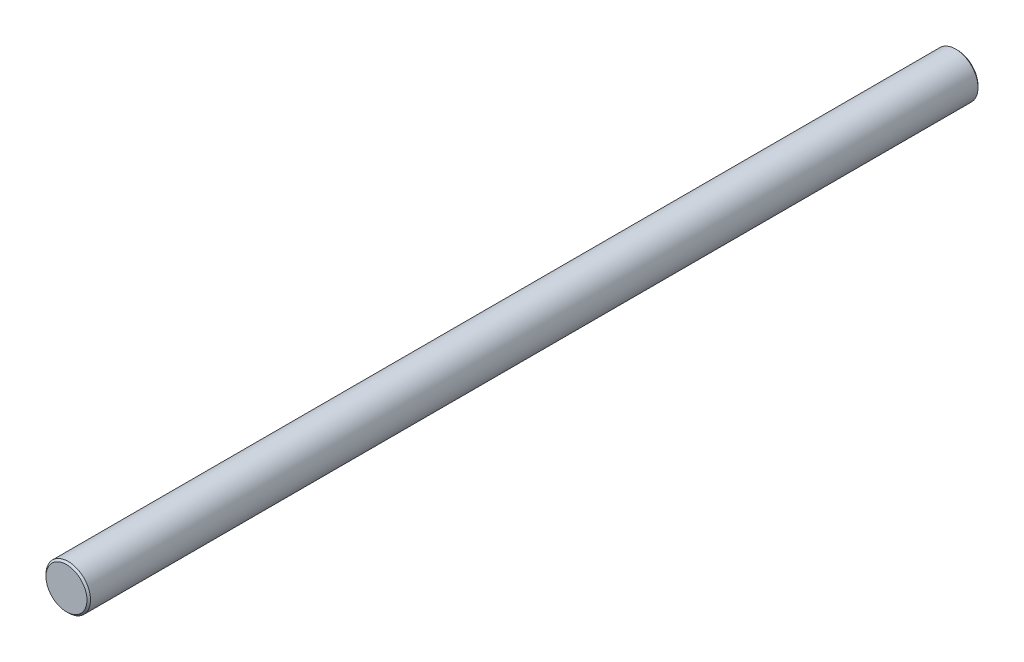
ISO-10303-21;
HEADER;
FILE_DESCRIPTION(('STEP AP214'),'2;1');
FILE_NAME('part.step','',(''),(''),'','','');
FILE_SCHEMA(('AUTOMOTIVE_DESIGN { 1 0 10303 214 1 1 1 1 }'));
ENDSEC;
DATA;
#1=APPLICATION_CONTEXT('core data for automotive mechanical design processes');
#2=APPLICATION_PROTOCOL_DEFINITION('international standard','automotive_design',2000,#1);
#3=PRODUCT_CONTEXT('',#1,'mechanical');
#4=PRODUCT('Part','Part','',(#3));
#5=PRODUCT_RELATED_PRODUCT_CATEGORY('part','',(#4));
#6=PRODUCT_DEFINITION_FORMATION('','',#4);
#7=PRODUCT_DEFINITION_CONTEXT('part definition',#1,'design');
#8=PRODUCT_DEFINITION('design','',#6,#7);
#9=PRODUCT_DEFINITION_SHAPE('','',#8);
#10=(LENGTH_UNIT() NAMED_UNIT(*) SI_UNIT(.MILLI.,.METRE.));
#11=(NAMED_UNIT(*) PLANE_ANGLE_UNIT() SI_UNIT($,.RADIAN.));
#12=(NAMED_UNIT(*) SI_UNIT($,.STERADIAN.) SOLID_ANGLE_UNIT());
#13=UNCERTAINTY_MEASURE_WITH_UNIT(LENGTH_MEASURE(1.E-05),#10,'distance_accuracy_value','');
#14=(GEOMETRIC_REPRESENTATION_CONTEXT(3) GLOBAL_UNCERTAINTY_ASSIGNED_CONTEXT((#13)) GLOBAL_UNIT_ASSIGNED_CONTEXT((#10,
#11,#12)) REPRESENTATION_CONTEXT('',''));
#15=CARTESIAN_POINT('',(0.,0.,0.));
#16=DIRECTION('',(0.,0.,1.));
#17=DIRECTION('',(1.,0.,0.));
#18=AXIS2_PLACEMENT_3D('',#15,#16,#17);
#19=CARTESIAN_POINT('',(8.88178419700125E-13,0.,250.));
#20=DIRECTION('',(0.,0.,-1.));
#21=DIRECTION('',(-1.,0.,0.));
#22=AXIS2_PLACEMENT_3D('',#19,#20,#21);
#23=CYLINDRICAL_SURFACE('',#22,12.5);
#24=CARTESIAN_POINT('',(0.,0.,-249.));
#25=DIRECTION('',(0.,0.,1.));
#26=DIRECTION('',(1.,0.,0.));
#27=AXIS2_PLACEMENT_3D('',#24,#25,#26);
#28=CIRCLE('',#27,12.5);
#29=CARTESIAN_POINT('',(12.5,0.,-249.));
#30=VERTEX_POINT('',#29);
#31=EDGE_CURVE('E55',#30,#30,#28,.T.);
#32=ORIENTED_EDGE('',*,*,#31,.T.);
#33=EDGE_LOOP('',(#32));
#34=FACE_BOUND('',#33,.T.);
#35=CARTESIAN_POINT('',(8.88178419700125E-13,0.,249.));
#36=DIRECTION('',(0.,0.,1.));
#37=DIRECTION('',(1.,0.,0.));
#38=AXIS2_PLACEMENT_3D('',#35,#36,#37);
#39=CIRCLE('',#38,12.5);
#40=CARTESIAN_POINT('',(12.5000000000009,0.,249.));
#41=VERTEX_POINT('',#40);
#42=EDGE_CURVE('E59',#41,#41,#39,.F.);
#43=ORIENTED_EDGE('',*,*,#42,.T.);
#44=EDGE_LOOP('',(#43));
#45=FACE_BOUND('',#44,.T.);
#46=ADVANCED_FACE('F44',(#34,#45),#23,.T.);
#47=CARTESIAN_POINT('',(8.88178419700125E-13,0.,250.));
#48=DIRECTION('',(0.,0.,1.));
#49=DIRECTION('',(1.,0.,0.));
#50=AXIS2_PLACEMENT_3D('',#47,#48,#49);
#51=PLANE('',#50);
#52=CARTESIAN_POINT('',(8.88178419700125E-13,0.,250.));
#53=DIRECTION('',(0.,0.,1.));
#54=DIRECTION('',(1.,0.,0.));
#55=AXIS2_PLACEMENT_3D('',#52,#53,#54);
#56=CIRCLE('',#55,11.5000000000001);
#57=CARTESIAN_POINT('',(11.500000000001,0.,250.));
#58=VERTEX_POINT('',#57);
#59=EDGE_CURVE('E12',#58,#58,#56,.T.);
#60=ORIENTED_EDGE('',*,*,#59,.T.);
#61=EDGE_LOOP('',(#60));
#62=FACE_BOUND('',#61,.T.);
#63=ADVANCED_FACE('F75',(#62),#51,.T.);
#64=CARTESIAN_POINT('',(0.,0.,-250.));
#65=DIRECTION('',(0.,0.,1.));
#66=DIRECTION('',(1.,0.,0.));
#67=AXIS2_PLACEMENT_3D('',#64,#65,#66);
#68=PLANE('',#67);
#69=CARTESIAN_POINT('',(0.,0.,-250.));
#70=DIRECTION('',(0.,0.,1.));
#71=DIRECTION('',(1.,0.,0.));
#72=AXIS2_PLACEMENT_3D('',#69,#70,#71);
#73=CIRCLE('',#72,11.5);
#74=CARTESIAN_POINT('',(11.5,0.,-250.));
#75=VERTEX_POINT('',#74);
#76=EDGE_CURVE('E51',#75,#75,#73,.F.);
#77=ORIENTED_EDGE('',*,*,#76,.T.);
#78=EDGE_LOOP('',(#77));
#79=FACE_BOUND('',#78,.T.);
#80=ADVANCED_FACE('F72',(#79),#68,.F.);
#81=CARTESIAN_POINT('',(0.,0.,-249.));
#82=DIRECTION('',(0.,0.,1.));
#83=DIRECTION('',(1.,0.,0.));
#84=AXIS2_PLACEMENT_3D('',#81,#82,#83);
#85=CONICAL_SURFACE('',#84,12.5,0.785398163397471);
#86=ORIENTED_EDGE('',*,*,#76,.F.);
#87=EDGE_LOOP('',(#86));
#88=FACE_BOUND('',#87,.T.);
#89=ORIENTED_EDGE('',*,*,#31,.F.);
#90=EDGE_LOOP('',(#89));
#91=FACE_BOUND('',#90,.T.);
#92=ADVANCED_FACE('F68',(#88,#91),#85,.T.);
#93=CARTESIAN_POINT('',(8.88178419700125E-13,0.,250.));
#94=DIRECTION('',(0.,0.,-1.));
#95=DIRECTION('',(-1.,0.,0.));
#96=AXIS2_PLACEMENT_3D('',#93,#94,#95);
#97=CONICAL_SURFACE('',#96,11.5000000000001,0.785398163397429);
#98=ORIENTED_EDGE('',*,*,#42,.F.);
#99=EDGE_LOOP('',(#98));
#100=FACE_BOUND('',#99,.T.);
#101=ORIENTED_EDGE('',*,*,#59,.F.);
#102=EDGE_LOOP('',(#101));
#103=FACE_BOUND('',#102,.T.);
#104=ADVANCED_FACE('F46',(#100,#103),#97,.T.);
#105=CLOSED_SHELL('',(#46,#63,#80,#92,#104));
#106=MANIFOLD_SOLID_BREP('B2',#105);
#107=ADVANCED_BREP_SHAPE_REPRESENTATION('',(#18,#106),#14);
#108=SHAPE_DEFINITION_REPRESENTATION(#9,#107);
ENDSEC;
END-ISO-10303-21;
